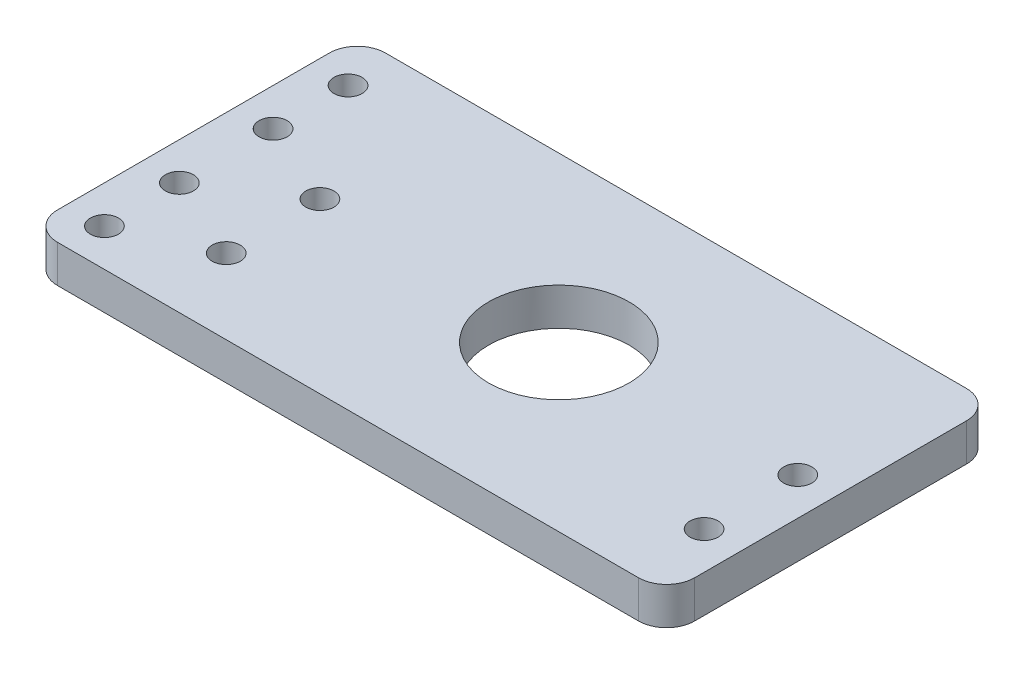
ISO-10303-21;
HEADER;
FILE_DESCRIPTION(('STEP AP214'),'2;1');
FILE_NAME('part.step','',(''),(''),'','','');
FILE_SCHEMA(('AUTOMOTIVE_DESIGN { 1 0 10303 214 1 1 1 1 }'));
ENDSEC;
DATA;
#1=APPLICATION_CONTEXT('core data for automotive mechanical design processes');
#2=APPLICATION_PROTOCOL_DEFINITION('international standard','automotive_design',2000,#1);
#3=PRODUCT_CONTEXT('',#1,'mechanical');
#4=PRODUCT('Part','Part','',(#3));
#5=PRODUCT_RELATED_PRODUCT_CATEGORY('part','',(#4));
#6=PRODUCT_DEFINITION_FORMATION('','',#4);
#7=PRODUCT_DEFINITION_CONTEXT('part definition',#1,'design');
#8=PRODUCT_DEFINITION('design','',#6,#7);
#9=PRODUCT_DEFINITION_SHAPE('','',#8);
#10=(LENGTH_UNIT() NAMED_UNIT(*) SI_UNIT(.MILLI.,.METRE.));
#11=(NAMED_UNIT(*) PLANE_ANGLE_UNIT() SI_UNIT($,.RADIAN.));
#12=(NAMED_UNIT(*) SI_UNIT($,.STERADIAN.) SOLID_ANGLE_UNIT());
#13=UNCERTAINTY_MEASURE_WITH_UNIT(LENGTH_MEASURE(1.E-05),#10,'distance_accuracy_value','');
#14=(GEOMETRIC_REPRESENTATION_CONTEXT(3) GLOBAL_UNCERTAINTY_ASSIGNED_CONTEXT((#13)) GLOBAL_UNIT_ASSIGNED_CONTEXT((#10,
#11,#12)) REPRESENTATION_CONTEXT('',''));
#15=CARTESIAN_POINT('',(0.,0.,0.));
#16=DIRECTION('',(0.,0.,1.));
#17=DIRECTION('',(1.,0.,0.));
#18=AXIS2_PLACEMENT_3D('',#15,#16,#17);
#19=CARTESIAN_POINT('',(0.,4.,0.));
#20=DIRECTION('',(0.,-1.,0.));
#21=DIRECTION('',(0.,0.,-1.));
#22=AXIS2_PLACEMENT_3D('',#19,#20,#21);
#23=PLANE('',#22);
#24=CARTESIAN_POINT('',(30.,4.,-0.499999999999997));
#25=DIRECTION('',(0.,1.,0.));
#26=DIRECTION('',(0.,0.,1.));
#27=AXIS2_PLACEMENT_3D('',#24,#25,#26);
#28=CIRCLE('',#27,1.5);
#29=CARTESIAN_POINT('',(30.,4.,1.));
#30=VERTEX_POINT('',#29);
#31=EDGE_CURVE('E427',#30,#30,#28,.T.);
#32=ORIENTED_EDGE('',*,*,#31,.F.);
#33=EDGE_LOOP('',(#32));
#34=FACE_BOUND('',#33,.T.);
#35=CARTESIAN_POINT('',(-21.,4.,9.50000000000001));
#36=DIRECTION('',(0.,1.,0.));
#37=DIRECTION('',(0.,0.,1.));
#38=AXIS2_PLACEMENT_3D('',#35,#36,#37);
#39=CIRCLE('',#38,1.5);
#40=CARTESIAN_POINT('',(-21.,4.,11.));
#41=VERTEX_POINT('',#40);
#42=EDGE_CURVE('E428',#41,#41,#39,.T.);
#43=ORIENTED_EDGE('',*,*,#42,.F.);
#44=EDGE_LOOP('',(#43));
#45=FACE_BOUND('',#44,.T.);
#46=CARTESIAN_POINT('',(30.,4.,9.50000000000001));
#47=DIRECTION('',(0.,1.,0.));
#48=DIRECTION('',(0.,0.,1.));
#49=AXIS2_PLACEMENT_3D('',#46,#47,#48);
#50=CIRCLE('',#49,1.5);
#51=CARTESIAN_POINT('',(30.,4.,11.));
#52=VERTEX_POINT('',#51);
#53=EDGE_CURVE('E432',#52,#52,#50,.T.);
#54=ORIENTED_EDGE('',*,*,#53,.F.);
#55=EDGE_LOOP('',(#54));
#56=FACE_BOUND('',#55,.T.);
#57=CARTESIAN_POINT('',(5.,4.,0.));
#58=DIRECTION('',(0.,1.,0.));
#59=DIRECTION('',(0.,0.,1.));
#60=AXIS2_PLACEMENT_3D('',#57,#58,#59);
#61=CIRCLE('',#60,7.5);
#62=CARTESIAN_POINT('',(5.,4.,7.5));
#63=VERTEX_POINT('',#62);
#64=EDGE_CURVE('E435',#63,#63,#61,.T.);
#65=ORIENTED_EDGE('',*,*,#64,.F.);
#66=EDGE_LOOP('',(#65));
#67=FACE_BOUND('',#66,.T.);
#68=CARTESIAN_POINT('',(-21.,4.,-0.499999999999997));
#69=DIRECTION('',(0.,1.,0.));
#70=DIRECTION('',(0.,0.,1.));
#71=AXIS2_PLACEMENT_3D('',#68,#69,#70);
#72=CIRCLE('',#71,1.5);
#73=CARTESIAN_POINT('',(-21.,4.,1.));
#74=VERTEX_POINT('',#73);
#75=EDGE_CURVE('E179',#74,#74,#72,.T.);
#76=ORIENTED_EDGE('',*,*,#75,.F.);
#77=EDGE_LOOP('',(#76));
#78=FACE_BOUND('',#77,.T.);
#79=DIRECTION('',(1.,0.,0.));
#80=VECTOR('',#79,1.);
#81=CARTESIAN_POINT('',(-34.,4.,17.5));
#82=LINE('',#81,#80);
#83=CARTESIAN_POINT('',(-31.,4.,17.5));
#84=VERTEX_POINT('',#83);
#85=CARTESIAN_POINT('',(31.,4.,17.5));
#86=VERTEX_POINT('',#85);
#87=EDGE_CURVE('E147',#84,#86,#82,.T.);
#88=ORIENTED_EDGE('',*,*,#87,.T.);
#89=CARTESIAN_POINT('',(31.,4.,14.5));
#90=DIRECTION('',(0.,-1.,0.));
#91=DIRECTION('',(0.,0.,-1.));
#92=AXIS2_PLACEMENT_3D('',#89,#90,#91);
#93=CIRCLE('',#92,3.);
#94=CARTESIAN_POINT('',(34.,4.,14.5));
#95=VERTEX_POINT('',#94);
#96=EDGE_CURVE('E166',#86,#95,#93,.F.);
#97=ORIENTED_EDGE('',*,*,#96,.T.);
#98=DIRECTION('',(0.,0.,-1.));
#99=VECTOR('',#98,1.);
#100=CARTESIAN_POINT('',(34.,4.,17.5));
#101=LINE('',#100,#99);
#102=CARTESIAN_POINT('',(34.,4.,-14.5));
#103=VERTEX_POINT('',#102);
#104=EDGE_CURVE('E130',#95,#103,#101,.T.);
#105=ORIENTED_EDGE('',*,*,#104,.T.);
#106=CARTESIAN_POINT('',(31.,4.,-14.5));
#107=DIRECTION('',(0.,-1.,0.));
#108=DIRECTION('',(0.,0.,-1.));
#109=AXIS2_PLACEMENT_3D('',#106,#107,#108);
#110=CIRCLE('',#109,3.);
#111=CARTESIAN_POINT('',(31.,4.,-17.5));
#112=VERTEX_POINT('',#111);
#113=EDGE_CURVE('E164',#103,#112,#110,.F.);
#114=ORIENTED_EDGE('',*,*,#113,.T.);
#115=DIRECTION('',(-1.,0.,0.));
#116=VECTOR('',#115,1.);
#117=CARTESIAN_POINT('',(-34.,4.,-17.5));
#118=LINE('',#117,#116);
#119=CARTESIAN_POINT('',(-31.,4.,-17.5));
#120=VERTEX_POINT('',#119);
#121=EDGE_CURVE('E216',#112,#120,#118,.T.);
#122=ORIENTED_EDGE('',*,*,#121,.T.);
#123=CARTESIAN_POINT('',(-31.,4.,-14.5));
#124=DIRECTION('',(0.,-1.,0.));
#125=DIRECTION('',(0.,0.,-1.));
#126=AXIS2_PLACEMENT_3D('',#123,#124,#125);
#127=CIRCLE('',#126,3.);
#128=CARTESIAN_POINT('',(-34.,4.,-14.5));
#129=VERTEX_POINT('',#128);
#130=EDGE_CURVE('E65',#120,#129,#127,.F.);
#131=ORIENTED_EDGE('',*,*,#130,.T.);
#132=DIRECTION('',(0.,0.,1.));
#133=VECTOR('',#132,1.);
#134=CARTESIAN_POINT('',(-34.,4.,17.5));
#135=LINE('',#134,#133);
#136=CARTESIAN_POINT('',(-34.,4.,14.5));
#137=VERTEX_POINT('',#136);
#138=EDGE_CURVE('E217',#129,#137,#135,.T.);
#139=ORIENTED_EDGE('',*,*,#138,.T.);
#140=CARTESIAN_POINT('',(-31.,4.,14.5));
#141=DIRECTION('',(0.,-1.,0.));
#142=DIRECTION('',(0.,0.,-1.));
#143=AXIS2_PLACEMENT_3D('',#140,#141,#142);
#144=CIRCLE('',#143,3.);
#145=EDGE_CURVE('E162',#137,#84,#144,.F.);
#146=ORIENTED_EDGE('',*,*,#145,.T.);
#147=EDGE_LOOP('',(#88,#97,#105,#114,#122,#131,#139,#146));
#148=FACE_BOUND('',#147,.T.);
#149=CARTESIAN_POINT('',(-30.,4.,-12.5));
#150=DIRECTION('',(0.,1.,0.));
#151=DIRECTION('',(0.,0.,1.));
#152=AXIS2_PLACEMENT_3D('',#149,#150,#151);
#153=CIRCLE('',#152,1.5);
#154=CARTESIAN_POINT('',(-30.,4.,-11.));
#155=VERTEX_POINT('',#154);
#156=EDGE_CURVE('E138',#155,#155,#153,.T.);
#157=ORIENTED_EDGE('',*,*,#156,.F.);
#158=EDGE_LOOP('',(#157));
#159=FACE_BOUND('',#158,.T.);
#160=CARTESIAN_POINT('',(-30.,4.,-4.5));
#161=DIRECTION('',(0.,1.,0.));
#162=DIRECTION('',(0.,0.,1.));
#163=AXIS2_PLACEMENT_3D('',#160,#161,#162);
#164=CIRCLE('',#163,1.5);
#165=CARTESIAN_POINT('',(-30.,4.,-3.));
#166=VERTEX_POINT('',#165);
#167=EDGE_CURVE('E208',#166,#166,#164,.T.);
#168=ORIENTED_EDGE('',*,*,#167,.F.);
#169=EDGE_LOOP('',(#168));
#170=FACE_BOUND('',#169,.T.);
#171=CARTESIAN_POINT('',(-30.,4.,5.5));
#172=DIRECTION('',(0.,1.,0.));
#173=DIRECTION('',(0.,0.,1.));
#174=AXIS2_PLACEMENT_3D('',#171,#172,#173);
#175=CIRCLE('',#174,1.5);
#176=CARTESIAN_POINT('',(-30.,4.,7.));
#177=VERTEX_POINT('',#176);
#178=EDGE_CURVE('E202',#177,#177,#175,.T.);
#179=ORIENTED_EDGE('',*,*,#178,.F.);
#180=EDGE_LOOP('',(#179));
#181=FACE_BOUND('',#180,.T.);
#182=CARTESIAN_POINT('',(-30.,4.,13.5));
#183=DIRECTION('',(0.,1.,0.));
#184=DIRECTION('',(0.,0.,1.));
#185=AXIS2_PLACEMENT_3D('',#182,#183,#184);
#186=CIRCLE('',#185,1.5);
#187=CARTESIAN_POINT('',(-30.,4.,15.));
#188=VERTEX_POINT('',#187);
#189=EDGE_CURVE('E193',#188,#188,#186,.T.);
#190=ORIENTED_EDGE('',*,*,#189,.F.);
#191=EDGE_LOOP('',(#190));
#192=FACE_BOUND('',#191,.T.);
#193=ADVANCED_FACE('F43',(#34,#45,#56,#67,#78,#148,#159,#170,#181,#192),#23,.F.);
#194=CARTESIAN_POINT('',(0.,0.,0.));
#195=DIRECTION('',(0.,-1.,0.));
#196=DIRECTION('',(0.,0.,-1.));
#197=AXIS2_PLACEMENT_3D('',#194,#195,#196);
#198=PLANE('',#197);
#199=CARTESIAN_POINT('',(30.,0.,-0.499999999999997));
#200=DIRECTION('',(0.,-1.,0.));
#201=DIRECTION('',(0.,0.,-1.));
#202=AXIS2_PLACEMENT_3D('',#199,#200,#201);
#203=CIRCLE('',#202,1.5);
#204=CARTESIAN_POINT('',(30.,0.,-2.));
#205=VERTEX_POINT('',#204);
#206=EDGE_CURVE('E47',#205,#205,#203,.T.);
#207=ORIENTED_EDGE('',*,*,#206,.F.);
#208=EDGE_LOOP('',(#207));
#209=FACE_BOUND('',#208,.T.);
#210=CARTESIAN_POINT('',(-21.,0.,9.50000000000001));
#211=DIRECTION('',(0.,-1.,0.));
#212=DIRECTION('',(0.,0.,-1.));
#213=AXIS2_PLACEMENT_3D('',#210,#211,#212);
#214=CIRCLE('',#213,1.5);
#215=CARTESIAN_POINT('',(-21.,0.,8.));
#216=VERTEX_POINT('',#215);
#217=EDGE_CURVE('E184',#216,#216,#214,.T.);
#218=ORIENTED_EDGE('',*,*,#217,.F.);
#219=EDGE_LOOP('',(#218));
#220=FACE_BOUND('',#219,.T.);
#221=CARTESIAN_POINT('',(30.,0.,9.50000000000001));
#222=DIRECTION('',(0.,-1.,0.));
#223=DIRECTION('',(0.,0.,-1.));
#224=AXIS2_PLACEMENT_3D('',#221,#222,#223);
#225=CIRCLE('',#224,1.5);
#226=CARTESIAN_POINT('',(30.,0.,8.00000000000001));
#227=VERTEX_POINT('',#226);
#228=EDGE_CURVE('E182',#227,#227,#225,.T.);
#229=ORIENTED_EDGE('',*,*,#228,.F.);
#230=EDGE_LOOP('',(#229));
#231=FACE_BOUND('',#230,.T.);
#232=CARTESIAN_POINT('',(5.,0.,0.));
#233=DIRECTION('',(0.,-1.,0.));
#234=DIRECTION('',(0.,0.,-1.));
#235=AXIS2_PLACEMENT_3D('',#232,#233,#234);
#236=CIRCLE('',#235,7.5);
#237=CARTESIAN_POINT('',(5.,0.,-7.5));
#238=VERTEX_POINT('',#237);
#239=EDGE_CURVE('E178',#238,#238,#236,.T.);
#240=ORIENTED_EDGE('',*,*,#239,.F.);
#241=EDGE_LOOP('',(#240));
#242=FACE_BOUND('',#241,.T.);
#243=CARTESIAN_POINT('',(-21.,0.,-0.499999999999997));
#244=DIRECTION('',(0.,-1.,0.));
#245=DIRECTION('',(0.,0.,-1.));
#246=AXIS2_PLACEMENT_3D('',#243,#244,#245);
#247=CIRCLE('',#246,1.5);
#248=CARTESIAN_POINT('',(-21.,0.,-2.));
#249=VERTEX_POINT('',#248);
#250=EDGE_CURVE('E175',#249,#249,#247,.T.);
#251=ORIENTED_EDGE('',*,*,#250,.F.);
#252=EDGE_LOOP('',(#251));
#253=FACE_BOUND('',#252,.T.);
#254=CARTESIAN_POINT('',(-30.,0.,5.5));
#255=DIRECTION('',(0.,1.,0.));
#256=DIRECTION('',(0.,0.,1.));
#257=AXIS2_PLACEMENT_3D('',#254,#255,#256);
#258=CIRCLE('',#257,1.5);
#259=CARTESIAN_POINT('',(-30.,0.,7.));
#260=VERTEX_POINT('',#259);
#261=EDGE_CURVE('E198',#260,#260,#258,.T.);
#262=ORIENTED_EDGE('',*,*,#261,.T.);
#263=EDGE_LOOP('',(#262));
#264=FACE_BOUND('',#263,.T.);
#265=CARTESIAN_POINT('',(-30.,0.,-12.5));
#266=DIRECTION('',(0.,1.,0.));
#267=DIRECTION('',(0.,0.,1.));
#268=AXIS2_PLACEMENT_3D('',#265,#266,#267);
#269=CIRCLE('',#268,1.5);
#270=CARTESIAN_POINT('',(-30.,0.,-11.));
#271=VERTEX_POINT('',#270);
#272=EDGE_CURVE('E144',#271,#271,#269,.T.);
#273=ORIENTED_EDGE('',*,*,#272,.T.);
#274=EDGE_LOOP('',(#273));
#275=FACE_BOUND('',#274,.T.);
#276=DIRECTION('',(0.,0.,-1.));
#277=VECTOR('',#276,1.);
#278=CARTESIAN_POINT('',(34.,0.,17.5));
#279=LINE('',#278,#277);
#280=CARTESIAN_POINT('',(34.,0.,14.5));
#281=VERTEX_POINT('',#280);
#282=CARTESIAN_POINT('',(34.,0.,-14.5));
#283=VERTEX_POINT('',#282);
#284=EDGE_CURVE('E127',#281,#283,#279,.T.);
#285=ORIENTED_EDGE('',*,*,#284,.F.);
#286=CARTESIAN_POINT('',(31.,0.,14.5));
#287=DIRECTION('',(0.,-1.,0.));
#288=DIRECTION('',(0.,0.,-1.));
#289=AXIS2_PLACEMENT_3D('',#286,#287,#288);
#290=CIRCLE('',#289,3.);
#291=CARTESIAN_POINT('',(31.,0.,17.5));
#292=VERTEX_POINT('',#291);
#293=EDGE_CURVE('E110',#281,#292,#290,.T.);
#294=ORIENTED_EDGE('',*,*,#293,.T.);
#295=DIRECTION('',(1.,0.,0.));
#296=VECTOR('',#295,1.);
#297=CARTESIAN_POINT('',(-34.,0.,17.5));
#298=LINE('',#297,#296);
#299=CARTESIAN_POINT('',(-31.,0.,17.5));
#300=VERTEX_POINT('',#299);
#301=EDGE_CURVE('E151',#300,#292,#298,.T.);
#302=ORIENTED_EDGE('',*,*,#301,.F.);
#303=CARTESIAN_POINT('',(-31.,0.,14.5));
#304=DIRECTION('',(0.,-1.,0.));
#305=DIRECTION('',(0.,0.,-1.));
#306=AXIS2_PLACEMENT_3D('',#303,#304,#305);
#307=CIRCLE('',#306,3.);
#308=CARTESIAN_POINT('',(-34.,0.,14.5));
#309=VERTEX_POINT('',#308);
#310=EDGE_CURVE('E155',#300,#309,#307,.T.);
#311=ORIENTED_EDGE('',*,*,#310,.T.);
#312=DIRECTION('',(0.,0.,1.));
#313=VECTOR('',#312,1.);
#314=CARTESIAN_POINT('',(-34.,0.,17.5));
#315=LINE('',#314,#313);
#316=CARTESIAN_POINT('',(-34.,0.,-14.5));
#317=VERTEX_POINT('',#316);
#318=EDGE_CURVE('E141',#317,#309,#315,.T.);
#319=ORIENTED_EDGE('',*,*,#318,.F.);
#320=CARTESIAN_POINT('',(-31.,0.,-14.5));
#321=DIRECTION('',(0.,-1.,0.));
#322=DIRECTION('',(0.,0.,-1.));
#323=AXIS2_PLACEMENT_3D('',#320,#321,#322);
#324=CIRCLE('',#323,3.);
#325=CARTESIAN_POINT('',(-31.,0.,-17.5));
#326=VERTEX_POINT('',#325);
#327=EDGE_CURVE('E131',#317,#326,#324,.T.);
#328=ORIENTED_EDGE('',*,*,#327,.T.);
#329=DIRECTION('',(-1.,0.,0.));
#330=VECTOR('',#329,1.);
#331=CARTESIAN_POINT('',(-34.,0.,-17.5));
#332=LINE('',#331,#330);
#333=CARTESIAN_POINT('',(31.,0.,-17.5));
#334=VERTEX_POINT('',#333);
#335=EDGE_CURVE('E137',#334,#326,#332,.T.);
#336=ORIENTED_EDGE('',*,*,#335,.F.);
#337=CARTESIAN_POINT('',(31.,0.,-14.5));
#338=DIRECTION('',(0.,-1.,0.));
#339=DIRECTION('',(0.,0.,-1.));
#340=AXIS2_PLACEMENT_3D('',#337,#338,#339);
#341=CIRCLE('',#340,3.);
#342=EDGE_CURVE('E121',#334,#283,#341,.T.);
#343=ORIENTED_EDGE('',*,*,#342,.T.);
#344=EDGE_LOOP('',(#285,#294,#302,#311,#319,#328,#336,#343));
#345=FACE_BOUND('',#344,.T.);
#346=CARTESIAN_POINT('',(-30.,0.,-4.5));
#347=DIRECTION('',(0.,1.,0.));
#348=DIRECTION('',(0.,0.,1.));
#349=AXIS2_PLACEMENT_3D('',#346,#347,#348);
#350=CIRCLE('',#349,1.5);
#351=CARTESIAN_POINT('',(-30.,0.,-3.));
#352=VERTEX_POINT('',#351);
#353=EDGE_CURVE('E205',#352,#352,#350,.T.);
#354=ORIENTED_EDGE('',*,*,#353,.T.);
#355=EDGE_LOOP('',(#354));
#356=FACE_BOUND('',#355,.T.);
#357=CARTESIAN_POINT('',(-30.,0.,13.5));
#358=DIRECTION('',(0.,1.,0.));
#359=DIRECTION('',(0.,0.,1.));
#360=AXIS2_PLACEMENT_3D('',#357,#358,#359);
#361=CIRCLE('',#360,1.5);
#362=CARTESIAN_POINT('',(-30.,0.,15.));
#363=VERTEX_POINT('',#362);
#364=EDGE_CURVE('E189',#363,#363,#361,.T.);
#365=ORIENTED_EDGE('',*,*,#364,.T.);
#366=EDGE_LOOP('',(#365));
#367=FACE_BOUND('',#366,.T.);
#368=ADVANCED_FACE('F134',(#209,#220,#231,#242,#253,#264,#275,#345,#356,#367),#198,.T.);
#369=CARTESIAN_POINT('',(34.,4.,17.5));
#370=DIRECTION('',(-1.,0.,0.));
#371=DIRECTION('',(0.,0.,1.));
#372=AXIS2_PLACEMENT_3D('',#369,#370,#371);
#373=PLANE('',#372);
#374=ORIENTED_EDGE('',*,*,#104,.F.);
#375=DIRECTION('',(0.,-1.,0.));
#376=VECTOR('',#375,1.);
#377=CARTESIAN_POINT('',(34.,4.,14.5));
#378=LINE('',#377,#376);
#379=EDGE_CURVE('E114',#95,#281,#378,.T.);
#380=ORIENTED_EDGE('',*,*,#379,.T.);
#381=ORIENTED_EDGE('',*,*,#284,.T.);
#382=DIRECTION('',(0.,-1.,0.));
#383=VECTOR('',#382,1.);
#384=CARTESIAN_POINT('',(34.,4.,-14.5));
#385=LINE('',#384,#383);
#386=EDGE_CURVE('E132',#283,#103,#385,.F.);
#387=ORIENTED_EDGE('',*,*,#386,.T.);
#388=EDGE_LOOP('',(#374,#380,#381,#387));
#389=FACE_BOUND('',#388,.T.);
#390=ADVANCED_FACE('F126',(#389),#373,.F.);
#391=CARTESIAN_POINT('',(-34.,4.,-17.5));
#392=DIRECTION('',(0.,0.,1.));
#393=DIRECTION('',(1.,0.,0.));
#394=AXIS2_PLACEMENT_3D('',#391,#392,#393);
#395=PLANE('',#394);
#396=ORIENTED_EDGE('',*,*,#121,.F.);
#397=DIRECTION('',(0.,-1.,0.));
#398=VECTOR('',#397,1.);
#399=CARTESIAN_POINT('',(31.,4.,-17.5));
#400=LINE('',#399,#398);
#401=EDGE_CURVE('E170',#112,#334,#400,.T.);
#402=ORIENTED_EDGE('',*,*,#401,.T.);
#403=ORIENTED_EDGE('',*,*,#335,.T.);
#404=DIRECTION('',(0.,-1.,0.));
#405=VECTOR('',#404,1.);
#406=CARTESIAN_POINT('',(-31.,4.,-17.5));
#407=LINE('',#406,#405);
#408=EDGE_CURVE('E168',#326,#120,#407,.F.);
#409=ORIENTED_EDGE('',*,*,#408,.T.);
#410=EDGE_LOOP('',(#396,#402,#403,#409));
#411=FACE_BOUND('',#410,.T.);
#412=ADVANCED_FACE('F234',(#411),#395,.F.);
#413=CARTESIAN_POINT('',(-34.,4.,17.5));
#414=DIRECTION('',(1.,0.,0.));
#415=DIRECTION('',(0.,0.,-1.));
#416=AXIS2_PLACEMENT_3D('',#413,#414,#415);
#417=PLANE('',#416);
#418=ORIENTED_EDGE('',*,*,#318,.T.);
#419=DIRECTION('',(0.,-1.,0.));
#420=VECTOR('',#419,1.);
#421=CARTESIAN_POINT('',(-34.,4.,14.5));
#422=LINE('',#421,#420);
#423=EDGE_CURVE('E11',#309,#137,#422,.F.);
#424=ORIENTED_EDGE('',*,*,#423,.T.);
#425=ORIENTED_EDGE('',*,*,#138,.F.);
#426=DIRECTION('',(0.,-1.,0.));
#427=VECTOR('',#426,1.);
#428=CARTESIAN_POINT('',(-34.,4.,-14.5));
#429=LINE('',#428,#427);
#430=EDGE_CURVE('E52',#129,#317,#429,.T.);
#431=ORIENTED_EDGE('',*,*,#430,.T.);
#432=EDGE_LOOP('',(#418,#424,#425,#431));
#433=FACE_BOUND('',#432,.T.);
#434=ADVANCED_FACE('F228',(#433),#417,.F.);
#435=CARTESIAN_POINT('',(-34.,4.,17.5));
#436=DIRECTION('',(0.,0.,-1.));
#437=DIRECTION('',(-1.,0.,0.));
#438=AXIS2_PLACEMENT_3D('',#435,#436,#437);
#439=PLANE('',#438);
#440=ORIENTED_EDGE('',*,*,#301,.T.);
#441=DIRECTION('',(0.,-1.,0.));
#442=VECTOR('',#441,1.);
#443=CARTESIAN_POINT('',(31.,4.,17.5));
#444=LINE('',#443,#442);
#445=EDGE_CURVE('E115',#292,#86,#444,.F.);
#446=ORIENTED_EDGE('',*,*,#445,.T.);
#447=ORIENTED_EDGE('',*,*,#87,.F.);
#448=DIRECTION('',(0.,-1.,0.));
#449=VECTOR('',#448,1.);
#450=CARTESIAN_POINT('',(-31.,4.,17.5));
#451=LINE('',#450,#449);
#452=EDGE_CURVE('E120',#84,#300,#451,.T.);
#453=ORIENTED_EDGE('',*,*,#452,.T.);
#454=EDGE_LOOP('',(#440,#446,#447,#453));
#455=FACE_BOUND('',#454,.T.);
#456=ADVANCED_FACE('F224',(#455),#439,.F.);
#457=CARTESIAN_POINT('',(-30.,4.,-12.5));
#458=DIRECTION('',(0.,-1.,0.));
#459=DIRECTION('',(0.,0.,-1.));
#460=AXIS2_PLACEMENT_3D('',#457,#458,#459);
#461=CYLINDRICAL_SURFACE('',#460,1.5);
#462=ORIENTED_EDGE('',*,*,#156,.T.);
#463=EDGE_LOOP('',(#462));
#464=FACE_BOUND('',#463,.T.);
#465=ORIENTED_EDGE('',*,*,#272,.F.);
#466=EDGE_LOOP('',(#465));
#467=FACE_BOUND('',#466,.T.);
#468=ADVANCED_FACE('F259',(#464,#467),#461,.F.);
#469=CARTESIAN_POINT('',(-30.,4.,-4.5));
#470=DIRECTION('',(0.,-1.,0.));
#471=DIRECTION('',(0.,0.,-1.));
#472=AXIS2_PLACEMENT_3D('',#469,#470,#471);
#473=CYLINDRICAL_SURFACE('',#472,1.5);
#474=ORIENTED_EDGE('',*,*,#167,.T.);
#475=EDGE_LOOP('',(#474));
#476=FACE_BOUND('',#475,.T.);
#477=ORIENTED_EDGE('',*,*,#353,.F.);
#478=EDGE_LOOP('',(#477));
#479=FACE_BOUND('',#478,.T.);
#480=ADVANCED_FACE('F374',(#476,#479),#473,.F.);
#481=CARTESIAN_POINT('',(-30.,4.,5.5));
#482=DIRECTION('',(0.,-1.,0.));
#483=DIRECTION('',(0.,0.,-1.));
#484=AXIS2_PLACEMENT_3D('',#481,#482,#483);
#485=CYLINDRICAL_SURFACE('',#484,1.5);
#486=ORIENTED_EDGE('',*,*,#178,.T.);
#487=EDGE_LOOP('',(#486));
#488=FACE_BOUND('',#487,.T.);
#489=ORIENTED_EDGE('',*,*,#261,.F.);
#490=EDGE_LOOP('',(#489));
#491=FACE_BOUND('',#490,.T.);
#492=ADVANCED_FACE('F372',(#488,#491),#485,.F.);
#493=CARTESIAN_POINT('',(-30.,4.,13.5));
#494=DIRECTION('',(0.,-1.,0.));
#495=DIRECTION('',(0.,0.,-1.));
#496=AXIS2_PLACEMENT_3D('',#493,#494,#495);
#497=CYLINDRICAL_SURFACE('',#496,1.5);
#498=ORIENTED_EDGE('',*,*,#189,.T.);
#499=EDGE_LOOP('',(#498));
#500=FACE_BOUND('',#499,.T.);
#501=ORIENTED_EDGE('',*,*,#364,.F.);
#502=EDGE_LOOP('',(#501));
#503=FACE_BOUND('',#502,.T.);
#504=ADVANCED_FACE('F245',(#500,#503),#497,.F.);
#505=CARTESIAN_POINT('',(31.,4.,14.5));
#506=DIRECTION('',(0.,-1.,0.));
#507=DIRECTION('',(0.,0.,-1.));
#508=AXIS2_PLACEMENT_3D('',#505,#506,#507);
#509=CYLINDRICAL_SURFACE('',#508,3.);
#510=ORIENTED_EDGE('',*,*,#96,.F.);
#511=ORIENTED_EDGE('',*,*,#445,.F.);
#512=ORIENTED_EDGE('',*,*,#293,.F.);
#513=ORIENTED_EDGE('',*,*,#379,.F.);
#514=EDGE_LOOP('',(#510,#511,#512,#513));
#515=FACE_BOUND('',#514,.T.);
#516=ADVANCED_FACE('F113',(#515),#509,.T.);
#517=CARTESIAN_POINT('',(31.,4.,-14.5));
#518=DIRECTION('',(0.,-1.,0.));
#519=DIRECTION('',(0.,0.,-1.));
#520=AXIS2_PLACEMENT_3D('',#517,#518,#519);
#521=CYLINDRICAL_SURFACE('',#520,3.);
#522=ORIENTED_EDGE('',*,*,#113,.F.);
#523=ORIENTED_EDGE('',*,*,#386,.F.);
#524=ORIENTED_EDGE('',*,*,#342,.F.);
#525=ORIENTED_EDGE('',*,*,#401,.F.);
#526=EDGE_LOOP('',(#522,#523,#524,#525));
#527=FACE_BOUND('',#526,.T.);
#528=ADVANCED_FACE('F238',(#527),#521,.T.);
#529=CARTESIAN_POINT('',(-31.,4.,14.5));
#530=DIRECTION('',(0.,-1.,0.));
#531=DIRECTION('',(0.,0.,-1.));
#532=AXIS2_PLACEMENT_3D('',#529,#530,#531);
#533=CYLINDRICAL_SURFACE('',#532,3.);
#534=ORIENTED_EDGE('',*,*,#145,.F.);
#535=ORIENTED_EDGE('',*,*,#423,.F.);
#536=ORIENTED_EDGE('',*,*,#310,.F.);
#537=ORIENTED_EDGE('',*,*,#452,.F.);
#538=EDGE_LOOP('',(#534,#535,#536,#537));
#539=FACE_BOUND('',#538,.T.);
#540=ADVANCED_FACE('F226',(#539),#533,.T.);
#541=CARTESIAN_POINT('',(-31.,4.,-14.5));
#542=DIRECTION('',(0.,-1.,0.));
#543=DIRECTION('',(0.,0.,-1.));
#544=AXIS2_PLACEMENT_3D('',#541,#542,#543);
#545=CYLINDRICAL_SURFACE('',#544,3.);
#546=ORIENTED_EDGE('',*,*,#130,.F.);
#547=ORIENTED_EDGE('',*,*,#408,.F.);
#548=ORIENTED_EDGE('',*,*,#327,.F.);
#549=ORIENTED_EDGE('',*,*,#430,.F.);
#550=EDGE_LOOP('',(#546,#547,#548,#549));
#551=FACE_BOUND('',#550,.T.);
#552=ADVANCED_FACE('F45',(#551),#545,.T.);
#553=CARTESIAN_POINT('',(-21.,-6.,-0.499999999999997));
#554=DIRECTION('',(0.,1.,0.));
#555=DIRECTION('',(0.,0.,1.));
#556=AXIS2_PLACEMENT_3D('',#553,#554,#555);
#557=CYLINDRICAL_SURFACE('',#556,1.5);
#558=ORIENTED_EDGE('',*,*,#250,.T.);
#559=EDGE_LOOP('',(#558));
#560=FACE_BOUND('',#559,.T.);
#561=ORIENTED_EDGE('',*,*,#75,.T.);
#562=EDGE_LOOP('',(#561));
#563=FACE_BOUND('',#562,.T.);
#564=ADVANCED_FACE('F320',(#560,#563),#557,.F.);
#565=CARTESIAN_POINT('',(5.,-6.,0.));
#566=DIRECTION('',(0.,1.,0.));
#567=DIRECTION('',(0.,0.,1.));
#568=AXIS2_PLACEMENT_3D('',#565,#566,#567);
#569=CYLINDRICAL_SURFACE('',#568,7.5);
#570=ORIENTED_EDGE('',*,*,#239,.T.);
#571=EDGE_LOOP('',(#570));
#572=FACE_BOUND('',#571,.T.);
#573=ORIENTED_EDGE('',*,*,#64,.T.);
#574=EDGE_LOOP('',(#573));
#575=FACE_BOUND('',#574,.T.);
#576=ADVANCED_FACE('F328',(#572,#575),#569,.F.);
#577=CARTESIAN_POINT('',(30.,-6.,9.50000000000001));
#578=DIRECTION('',(0.,1.,0.));
#579=DIRECTION('',(0.,0.,1.));
#580=AXIS2_PLACEMENT_3D('',#577,#578,#579);
#581=CYLINDRICAL_SURFACE('',#580,1.5);
#582=ORIENTED_EDGE('',*,*,#228,.T.);
#583=EDGE_LOOP('',(#582));
#584=FACE_BOUND('',#583,.T.);
#585=ORIENTED_EDGE('',*,*,#53,.T.);
#586=EDGE_LOOP('',(#585));
#587=FACE_BOUND('',#586,.T.);
#588=ADVANCED_FACE('F338',(#584,#587),#581,.F.);
#589=CARTESIAN_POINT('',(-21.,-6.,9.50000000000001));
#590=DIRECTION('',(0.,1.,0.));
#591=DIRECTION('',(0.,0.,1.));
#592=AXIS2_PLACEMENT_3D('',#589,#590,#591);
#593=CYLINDRICAL_SURFACE('',#592,1.5);
#594=ORIENTED_EDGE('',*,*,#217,.T.);
#595=EDGE_LOOP('',(#594));
#596=FACE_BOUND('',#595,.T.);
#597=ORIENTED_EDGE('',*,*,#42,.T.);
#598=EDGE_LOOP('',(#597));
#599=FACE_BOUND('',#598,.T.);
#600=ADVANCED_FACE('F348',(#596,#599),#593,.F.);
#601=CARTESIAN_POINT('',(30.,-6.,-0.499999999999997));
#602=DIRECTION('',(0.,1.,0.));
#603=DIRECTION('',(0.,0.,1.));
#604=AXIS2_PLACEMENT_3D('',#601,#602,#603);
#605=CYLINDRICAL_SURFACE('',#604,1.5);
#606=ORIENTED_EDGE('',*,*,#206,.T.);
#607=EDGE_LOOP('',(#606));
#608=FACE_BOUND('',#607,.T.);
#609=ORIENTED_EDGE('',*,*,#31,.T.);
#610=EDGE_LOOP('',(#609));
#611=FACE_BOUND('',#610,.T.);
#612=ADVANCED_FACE('F358',(#608,#611),#605,.F.);
#613=CLOSED_SHELL('',(#193,#368,#390,#412,#434,#456,#468,#480,#492,#504,#516,#528,#540,#552,
#564,#576,#588,#600,#612));
#614=MANIFOLD_SOLID_BREP('B2',#613);
#615=ADVANCED_BREP_SHAPE_REPRESENTATION('',(#18,#614),#14);
#616=SHAPE_DEFINITION_REPRESENTATION(#9,#615);
ENDSEC;
END-ISO-10303-21;
